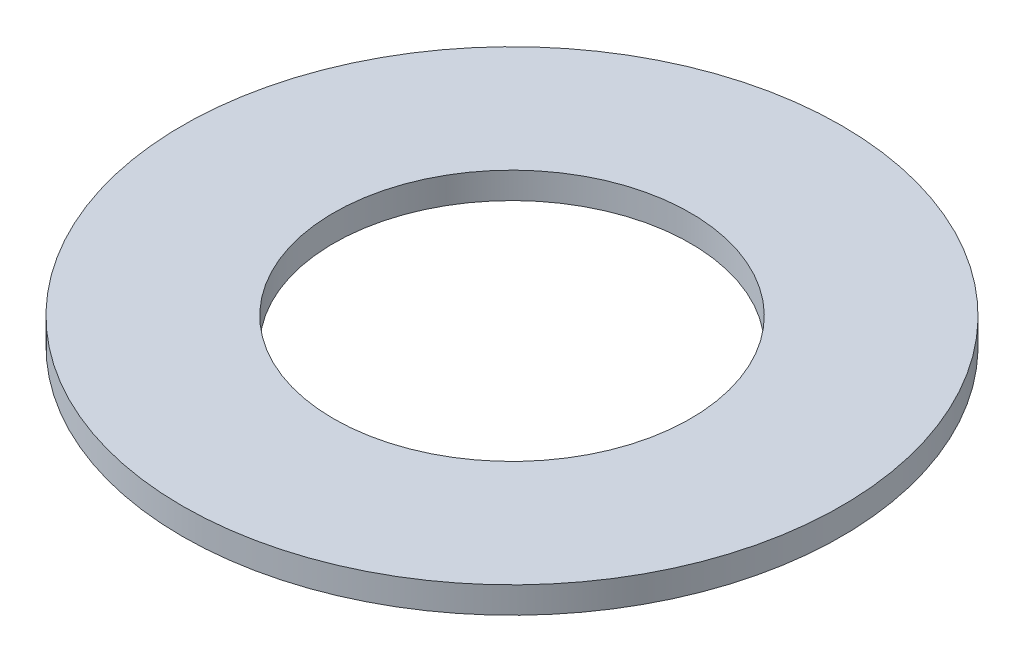
ISO-10303-21;
HEADER;
FILE_DESCRIPTION(('STEP AP214'),'2;1');
FILE_NAME('part.step','',(''),(''),'','','');
FILE_SCHEMA(('AUTOMOTIVE_DESIGN { 1 0 10303 214 1 1 1 1 }'));
ENDSEC;
DATA;
#1=APPLICATION_CONTEXT('core data for automotive mechanical design processes');
#2=APPLICATION_PROTOCOL_DEFINITION('international standard','automotive_design',2000,#1);
#3=PRODUCT_CONTEXT('',#1,'mechanical');
#4=PRODUCT('Part','Part','',(#3));
#5=PRODUCT_RELATED_PRODUCT_CATEGORY('part','',(#4));
#6=PRODUCT_DEFINITION_FORMATION('','',#4);
#7=PRODUCT_DEFINITION_CONTEXT('part definition',#1,'design');
#8=PRODUCT_DEFINITION('design','',#6,#7);
#9=PRODUCT_DEFINITION_SHAPE('','',#8);
#10=(LENGTH_UNIT() NAMED_UNIT(*) SI_UNIT(.MILLI.,.METRE.));
#11=(NAMED_UNIT(*) PLANE_ANGLE_UNIT() SI_UNIT($,.RADIAN.));
#12=(NAMED_UNIT(*) SI_UNIT($,.STERADIAN.) SOLID_ANGLE_UNIT());
#13=UNCERTAINTY_MEASURE_WITH_UNIT(LENGTH_MEASURE(1.E-05),#10,'distance_accuracy_value','');
#14=(GEOMETRIC_REPRESENTATION_CONTEXT(3) GLOBAL_UNCERTAINTY_ASSIGNED_CONTEXT((#13)) GLOBAL_UNIT_ASSIGNED_CONTEXT((#10,
#11,#12)) REPRESENTATION_CONTEXT('',''));
#15=CARTESIAN_POINT('',(0.,0.,0.));
#16=DIRECTION('',(0.,0.,1.));
#17=DIRECTION('',(1.,0.,0.));
#18=AXIS2_PLACEMENT_3D('',#15,#16,#17);
#19=CARTESIAN_POINT('',(0.,1.524,0.));
#20=DIRECTION('',(0.,-1.,0.));
#21=DIRECTION('',(0.,0.,-1.));
#22=AXIS2_PLACEMENT_3D('',#19,#20,#21);
#23=CYLINDRICAL_SURFACE('',#22,19.05);
#24=CARTESIAN_POINT('',(0.,1.524,0.));
#25=DIRECTION('',(0.,1.,0.));
#26=DIRECTION('',(0.,0.,1.));
#27=AXIS2_PLACEMENT_3D('',#24,#25,#26);
#28=CIRCLE('',#27,19.05);
#29=CARTESIAN_POINT('',(0.,1.524,-19.05));
#30=VERTEX_POINT('',#29);
#31=EDGE_CURVE('E10',#30,#30,#28,.T.);
#32=CARTESIAN_POINT('',(0.,0.,0.));
#33=DIRECTION('',(0.,1.,0.));
#34=DIRECTION('',(0.,0.,1.));
#35=AXIS2_PLACEMENT_3D('',#32,#33,#34);
#36=CIRCLE('',#35,19.05);
#37=CARTESIAN_POINT('',(0.,0.,-19.05));
#38=VERTEX_POINT('',#37);
#39=EDGE_CURVE('E35',#38,#38,#36,.T.);
#40=CARTESIAN_POINT('',(0.,1.524,-19.05));
#41=CARTESIAN_POINT('',(0.,1.508125,-19.05));
#42=CARTESIAN_POINT('',(0.,1.49225,-19.05));
#43=CARTESIAN_POINT('',(0.,1.4605,-19.05));
#44=CARTESIAN_POINT('',(0.,1.444625,-19.05));
#45=CARTESIAN_POINT('',(0.,1.412875,-19.05));
#46=CARTESIAN_POINT('',(0.,1.397,-19.05));
#47=CARTESIAN_POINT('',(0.,1.36525,-19.05));
#48=CARTESIAN_POINT('',(0.,1.349375,-19.05));
#49=CARTESIAN_POINT('',(0.,1.317625,-19.05));
#50=CARTESIAN_POINT('',(0.,1.30175,-19.05));
#51=CARTESIAN_POINT('',(0.,1.27,-19.05));
#52=CARTESIAN_POINT('',(0.,1.254125,-19.05));
#53=CARTESIAN_POINT('',(0.,1.222375,-19.05));
#54=CARTESIAN_POINT('',(0.,1.2065,-19.05));
#55=CARTESIAN_POINT('',(0.,1.17475,-19.05));
#56=CARTESIAN_POINT('',(0.,1.158875,-19.05));
#57=CARTESIAN_POINT('',(0.,1.127125,-19.05));
#58=CARTESIAN_POINT('',(0.,1.11125,-19.05));
#59=CARTESIAN_POINT('',(0.,1.0795,-19.05));
#60=CARTESIAN_POINT('',(0.,1.063625,-19.05));
#61=CARTESIAN_POINT('',(0.,1.031875,-19.05));
#62=CARTESIAN_POINT('',(0.,1.016,-19.05));
#63=CARTESIAN_POINT('',(0.,0.98425,-19.05));
#64=CARTESIAN_POINT('',(0.,0.968375,-19.05));
#65=CARTESIAN_POINT('',(0.,0.936625,-19.05));
#66=CARTESIAN_POINT('',(0.,0.92075,-19.05));
#67=CARTESIAN_POINT('',(0.,0.889,-19.05));
#68=CARTESIAN_POINT('',(0.,0.873125,-19.05));
#69=CARTESIAN_POINT('',(0.,0.841375,-19.05));
#70=CARTESIAN_POINT('',(0.,0.8255,-19.05));
#71=CARTESIAN_POINT('',(0.,0.79375,-19.05));
#72=CARTESIAN_POINT('',(0.,0.777875,-19.05));
#73=CARTESIAN_POINT('',(0.,0.746125,-19.05));
#74=CARTESIAN_POINT('',(0.,0.73025,-19.05));
#75=CARTESIAN_POINT('',(0.,0.6985,-19.05));
#76=CARTESIAN_POINT('',(0.,0.682625,-19.05));
#77=CARTESIAN_POINT('',(0.,0.650875,-19.05));
#78=CARTESIAN_POINT('',(0.,0.635,-19.05));
#79=CARTESIAN_POINT('',(0.,0.60325,-19.05));
#80=CARTESIAN_POINT('',(0.,0.587375,-19.05));
#81=CARTESIAN_POINT('',(0.,0.555625,-19.05));
#82=CARTESIAN_POINT('',(0.,0.53975,-19.05));
#83=CARTESIAN_POINT('',(0.,0.508,-19.05));
#84=CARTESIAN_POINT('',(0.,0.492125,-19.05));
#85=CARTESIAN_POINT('',(0.,0.460375,-19.05));
#86=CARTESIAN_POINT('',(0.,0.4445,-19.05));
#87=CARTESIAN_POINT('',(0.,0.41275,-19.05));
#88=CARTESIAN_POINT('',(0.,0.396875,-19.05));
#89=CARTESIAN_POINT('',(0.,0.365125,-19.05));
#90=CARTESIAN_POINT('',(0.,0.34925,-19.05));
#91=CARTESIAN_POINT('',(0.,0.3175,-19.05));
#92=CARTESIAN_POINT('',(0.,0.301625,-19.05));
#93=CARTESIAN_POINT('',(0.,0.269875,-19.05));
#94=CARTESIAN_POINT('',(0.,0.254,-19.05));
#95=CARTESIAN_POINT('',(0.,0.22225,-19.05));
#96=CARTESIAN_POINT('',(0.,0.206375,-19.05));
#97=CARTESIAN_POINT('',(0.,0.174625,-19.05));
#98=CARTESIAN_POINT('',(0.,0.15875,-19.05));
#99=CARTESIAN_POINT('',(0.,0.127,-19.05));
#100=CARTESIAN_POINT('',(0.,0.111125,-19.05));
#101=CARTESIAN_POINT('',(0.,0.079375,-19.05));
#102=CARTESIAN_POINT('',(0.,0.0635,-19.05));
#103=CARTESIAN_POINT('',(0.,0.0317499999999999,-19.05));
#104=CARTESIAN_POINT('',(0.,0.015875,-19.05));
#105=CARTESIAN_POINT('',(0.,0.,-19.05));
#106=B_SPLINE_CURVE_WITH_KNOTS('',3,(#40,#41,#42,#43,#44,#45,#46,#47,#48,#49,#50,#51,#52,#53,
#54,#55,#56,#57,#58,#59,#60,#61,#62,#63,#64,#65,#66,#67,#68,#69,#70,#71,#72,#73,#74,#75,#76,#77,
#78,#79,#80,#81,#82,#83,#84,#85,#86,#87,#88,#89,#90,#91,#92,#93,#94,#95,#96,#97,#98,#99,#100,
#101,#102,#103,#104,#105),.UNSPECIFIED.,.F.,.F.,(4,2,2,2,2,2,2,2,2,2,2,2,2,2,2,2,2,2,2,2,2,2,2,
2,2,2,2,2,2,2,2,2,4),(0.,0.0476249999999999,0.0952499999999998,0.142875,0.1905,0.238125,0.28575,
0.333375,0.381,0.428625,0.47625,0.523875,0.5715,0.619125,0.66675,0.714375,0.762,0.809625,
0.85725,0.904875,0.9525,1.000125,1.04775,1.095375,1.143,1.190625,1.23825,1.285875,1.3335,
1.381125,1.42875,1.476375,1.524),.UNSPECIFIED.);
#107=EDGE_CURVE('BSEAM32',#30,#38,#106,.T.);
#108=ORIENTED_EDGE('',*,*,#31,.F.);
#109=ORIENTED_EDGE('',*,*,#39,.T.);
#110=ORIENTED_EDGE('',*,*,#107,.T.);
#111=ORIENTED_EDGE('',*,*,#107,.F.);
#112=EDGE_LOOP('',(#108,#110,#109,#111));
#113=FACE_BOUND('',#112,.T.);
#114=ADVANCED_FACE('F32',(#113),#23,.T.);
#115=CARTESIAN_POINT('',(0.,1.524,0.));
#116=DIRECTION('',(0.,1.,0.));
#117=DIRECTION('',(0.,0.,1.));
#118=AXIS2_PLACEMENT_3D('',#115,#116,#117);
#119=PLANE('',#118);
#120=CARTESIAN_POINT('',(0.,1.524,0.));
#121=DIRECTION('',(0.,1.,0.));
#122=DIRECTION('',(0.,0.,1.));
#123=AXIS2_PLACEMENT_3D('',#120,#121,#122);
#124=CIRCLE('',#123,10.3124);
#125=CARTESIAN_POINT('',(0.,1.524,10.3124));
#126=VERTEX_POINT('',#125);
#127=EDGE_CURVE('E44',#126,#126,#124,.T.);
#128=ORIENTED_EDGE('',*,*,#127,.F.);
#129=EDGE_LOOP('',(#128));
#130=FACE_BOUND('',#129,.T.);
#131=ORIENTED_EDGE('',*,*,#31,.T.);
#132=EDGE_LOOP('',(#131));
#133=FACE_BOUND('',#132,.T.);
#134=ADVANCED_FACE('F59',(#130,#133),#119,.T.);
#135=CARTESIAN_POINT('',(0.,0.,0.));
#136=DIRECTION('',(0.,1.,0.));
#137=DIRECTION('',(0.,0.,1.));
#138=AXIS2_PLACEMENT_3D('',#135,#136,#137);
#139=PLANE('',#138);
#140=CARTESIAN_POINT('',(0.,0.,0.));
#141=DIRECTION('',(0.,1.,0.));
#142=DIRECTION('',(0.,0.,1.));
#143=AXIS2_PLACEMENT_3D('',#140,#141,#142);
#144=CIRCLE('',#143,10.3124);
#145=CARTESIAN_POINT('',(0.,0.,10.3124));
#146=VERTEX_POINT('',#145);
#147=EDGE_CURVE('E42',#146,#146,#144,.T.);
#148=ORIENTED_EDGE('',*,*,#147,.T.);
#149=EDGE_LOOP('',(#148));
#150=FACE_BOUND('',#149,.T.);
#151=ORIENTED_EDGE('',*,*,#39,.F.);
#152=EDGE_LOOP('',(#151));
#153=FACE_BOUND('',#152,.T.);
#154=ADVANCED_FACE('F50',(#150,#153),#139,.F.);
#155=CARTESIAN_POINT('',(0.,0.,0.));
#156=DIRECTION('',(0.,1.,0.));
#157=DIRECTION('',(0.,0.,1.));
#158=AXIS2_PLACEMENT_3D('',#155,#156,#157);
#159=CYLINDRICAL_SURFACE('',#158,10.3124);
#160=CARTESIAN_POINT('',(0.,0.,10.3124));
#161=CARTESIAN_POINT('',(0.,0.015875,10.3124));
#162=CARTESIAN_POINT('',(0.,0.03175,10.3124));
#163=CARTESIAN_POINT('',(0.,0.0635,10.3124));
#164=CARTESIAN_POINT('',(0.,0.079375,10.3124));
#165=CARTESIAN_POINT('',(0.,0.111125,10.3124));
#166=CARTESIAN_POINT('',(0.,0.127,10.3124));
#167=CARTESIAN_POINT('',(0.,0.15875,10.3124));
#168=CARTESIAN_POINT('',(0.,0.174625,10.3124));
#169=CARTESIAN_POINT('',(0.,0.206375,10.3124));
#170=CARTESIAN_POINT('',(0.,0.22225,10.3124));
#171=CARTESIAN_POINT('',(0.,0.254,10.3124));
#172=CARTESIAN_POINT('',(0.,0.269875,10.3124));
#173=CARTESIAN_POINT('',(0.,0.301625,10.3124));
#174=CARTESIAN_POINT('',(0.,0.3175,10.3124));
#175=CARTESIAN_POINT('',(0.,0.34925,10.3124));
#176=CARTESIAN_POINT('',(0.,0.365125,10.3124));
#177=CARTESIAN_POINT('',(0.,0.396875,10.3124));
#178=CARTESIAN_POINT('',(0.,0.41275,10.3124));
#179=CARTESIAN_POINT('',(0.,0.4445,10.3124));
#180=CARTESIAN_POINT('',(0.,0.460375,10.3124));
#181=CARTESIAN_POINT('',(0.,0.492125,10.3124));
#182=CARTESIAN_POINT('',(0.,0.508,10.3124));
#183=CARTESIAN_POINT('',(0.,0.53975,10.3124));
#184=CARTESIAN_POINT('',(0.,0.555625,10.3124));
#185=CARTESIAN_POINT('',(0.,0.587375,10.3124));
#186=CARTESIAN_POINT('',(0.,0.60325,10.3124));
#187=CARTESIAN_POINT('',(0.,0.635,10.3124));
#188=CARTESIAN_POINT('',(0.,0.650875,10.3124));
#189=CARTESIAN_POINT('',(0.,0.682625,10.3124));
#190=CARTESIAN_POINT('',(0.,0.6985,10.3124));
#191=CARTESIAN_POINT('',(0.,0.73025,10.3124));
#192=CARTESIAN_POINT('',(0.,0.746125,10.3124));
#193=CARTESIAN_POINT('',(0.,0.777875,10.3124));
#194=CARTESIAN_POINT('',(0.,0.79375,10.3124));
#195=CARTESIAN_POINT('',(0.,0.8255,10.3124));
#196=CARTESIAN_POINT('',(0.,0.841375,10.3124));
#197=CARTESIAN_POINT('',(0.,0.873125,10.3124));
#198=CARTESIAN_POINT('',(0.,0.889,10.3124));
#199=CARTESIAN_POINT('',(0.,0.92075,10.3124));
#200=CARTESIAN_POINT('',(0.,0.936625,10.3124));
#201=CARTESIAN_POINT('',(0.,0.968375,10.3124));
#202=CARTESIAN_POINT('',(0.,0.98425,10.3124));
#203=CARTESIAN_POINT('',(0.,1.016,10.3124));
#204=CARTESIAN_POINT('',(0.,1.031875,10.3124));
#205=CARTESIAN_POINT('',(0.,1.063625,10.3124));
#206=CARTESIAN_POINT('',(0.,1.0795,10.3124));
#207=CARTESIAN_POINT('',(0.,1.11125,10.3124));
#208=CARTESIAN_POINT('',(0.,1.127125,10.3124));
#209=CARTESIAN_POINT('',(0.,1.158875,10.3124));
#210=CARTESIAN_POINT('',(0.,1.17475,10.3124));
#211=CARTESIAN_POINT('',(0.,1.2065,10.3124));
#212=CARTESIAN_POINT('',(0.,1.222375,10.3124));
#213=CARTESIAN_POINT('',(0.,1.254125,10.3124));
#214=CARTESIAN_POINT('',(0.,1.27,10.3124));
#215=CARTESIAN_POINT('',(0.,1.30175,10.3124));
#216=CARTESIAN_POINT('',(0.,1.317625,10.3124));
#217=CARTESIAN_POINT('',(0.,1.349375,10.3124));
#218=CARTESIAN_POINT('',(0.,1.36525,10.3124));
#219=CARTESIAN_POINT('',(0.,1.397,10.3124));
#220=CARTESIAN_POINT('',(0.,1.412875,10.3124));
#221=CARTESIAN_POINT('',(0.,1.444625,10.3124));
#222=CARTESIAN_POINT('',(0.,1.4605,10.3124));
#223=CARTESIAN_POINT('',(0.,1.49225,10.3124));
#224=CARTESIAN_POINT('',(0.,1.508125,10.3124));
#225=CARTESIAN_POINT('',(0.,1.524,10.3124));
#226=B_SPLINE_CURVE_WITH_KNOTS('',3,(#160,#161,#162,#163,#164,#165,#166,#167,#168,#169,#170,
#171,#172,#173,#174,#175,#176,#177,#178,#179,#180,#181,#182,#183,#184,#185,#186,#187,#188,#189,
#190,#191,#192,#193,#194,#195,#196,#197,#198,#199,#200,#201,#202,#203,#204,#205,#206,#207,#208,
#209,#210,#211,#212,#213,#214,#215,#216,#217,#218,#219,#220,#221,#222,#223,#224,#225),
.UNSPECIFIED.,.F.,.F.,(4,2,2,2,2,2,2,2,2,2,2,2,2,2,2,2,2,2,2,2,2,2,2,2,2,2,2,2,2,2,2,2,4),(0.,
0.047625,0.09525,0.142875,0.1905,0.238125,0.28575,0.333375,0.381,0.428625,0.47625,0.523875,
0.5715,0.619125,0.66675,0.714375,0.762,0.809625,0.85725,0.904875,0.9525,1.000125,1.04775,
1.095375,1.143,1.190625,1.23825,1.285875,1.3335,1.381125,1.42875,1.476375,1.524),.UNSPECIFIED.);
#227=EDGE_CURVE('BSEAM53',#146,#126,#226,.T.);
#228=ORIENTED_EDGE('',*,*,#147,.F.);
#229=ORIENTED_EDGE('',*,*,#127,.T.);
#230=ORIENTED_EDGE('',*,*,#227,.T.);
#231=ORIENTED_EDGE('',*,*,#227,.F.);
#232=EDGE_LOOP('',(#228,#230,#229,#231));
#233=FACE_BOUND('',#232,.T.);
#234=ADVANCED_FACE('F53',(#233),#159,.F.);
#235=CLOSED_SHELL('',(#114,#134,#154,#234));
#236=MANIFOLD_SOLID_BREP('B2',#235);
#237=ADVANCED_BREP_SHAPE_REPRESENTATION('',(#18,#236),#14);
#238=SHAPE_DEFINITION_REPRESENTATION(#9,#237);
ENDSEC;
END-ISO-10303-21;
